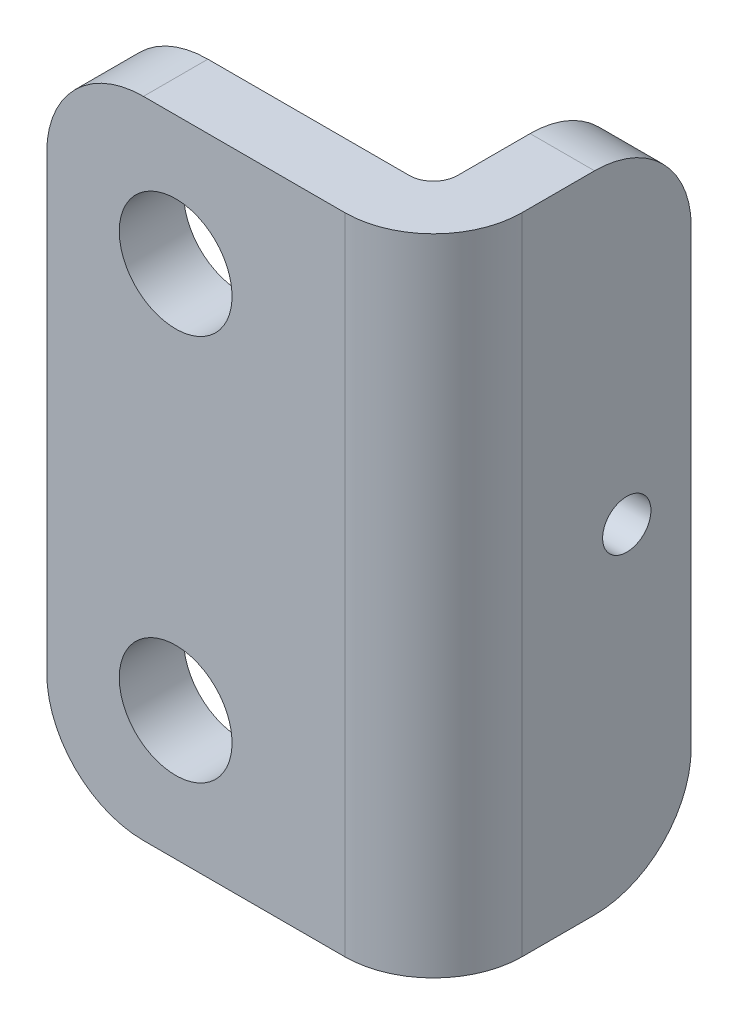
ISO-10303-21;
HEADER;
FILE_DESCRIPTION(('STEP AP214'),'2;1');
FILE_NAME('part.step','',(''),(''),'','','');
FILE_SCHEMA(('AUTOMOTIVE_DESIGN { 1 0 10303 214 1 1 1 1 }'));
ENDSEC;
DATA;
#1=APPLICATION_CONTEXT('core data for automotive mechanical design processes');
#2=APPLICATION_PROTOCOL_DEFINITION('international standard','automotive_design',2000,#1);
#3=PRODUCT_CONTEXT('',#1,'mechanical');
#4=PRODUCT('Part','Part','',(#3));
#5=PRODUCT_RELATED_PRODUCT_CATEGORY('part','',(#4));
#6=PRODUCT_DEFINITION_FORMATION('','',#4);
#7=PRODUCT_DEFINITION_CONTEXT('part definition',#1,'design');
#8=PRODUCT_DEFINITION('design','',#6,#7);
#9=PRODUCT_DEFINITION_SHAPE('','',#8);
#10=(LENGTH_UNIT() NAMED_UNIT(*) SI_UNIT(.MILLI.,.METRE.));
#11=(NAMED_UNIT(*) PLANE_ANGLE_UNIT() SI_UNIT($,.RADIAN.));
#12=(NAMED_UNIT(*) SI_UNIT($,.STERADIAN.) SOLID_ANGLE_UNIT());
#13=UNCERTAINTY_MEASURE_WITH_UNIT(LENGTH_MEASURE(1.E-05),#10,'distance_accuracy_value','');
#14=(GEOMETRIC_REPRESENTATION_CONTEXT(3) GLOBAL_UNCERTAINTY_ASSIGNED_CONTEXT((#13)) GLOBAL_UNIT_ASSIGNED_CONTEXT((#10,
#11,#12)) REPRESENTATION_CONTEXT('',''));
#15=CARTESIAN_POINT('',(0.,0.,0.));
#16=DIRECTION('',(0.,0.,1.));
#17=DIRECTION('',(1.,0.,0.));
#18=AXIS2_PLACEMENT_3D('',#15,#16,#17);
#19=CARTESIAN_POINT('',(-1.,20.,-1.75000000000001));
#20=DIRECTION('',(1.,0.,0.));
#21=DIRECTION('',(0.,0.,-1.));
#22=AXIS2_PLACEMENT_3D('',#19,#20,#21);
#23=PLANE('',#22);
#24=CARTESIAN_POINT('',(-1.,10.,-5.));
#25=DIRECTION('',(-1.,0.,0.));
#26=DIRECTION('',(0.,0.,1.));
#27=AXIS2_PLACEMENT_3D('',#24,#25,#26);
#28=CIRCLE('',#27,0.75);
#29=CARTESIAN_POINT('',(-1.,10.,-4.25));
#30=VERTEX_POINT('',#29);
#31=EDGE_CURVE('E234',#30,#30,#28,.T.);
#32=ORIENTED_EDGE('',*,*,#31,.F.);
#33=EDGE_LOOP('',(#32));
#34=FACE_BOUND('',#33,.T.);
#35=DIRECTION('',(0.,-1.,0.));
#36=VECTOR('',#35,1.);
#37=CARTESIAN_POINT('',(-1.,20.,-7.));
#38=LINE('',#37,#36);
#39=CARTESIAN_POINT('',(-1.,17.,-7.));
#40=VERTEX_POINT('',#39);
#41=CARTESIAN_POINT('',(-1.,3.,-7.));
#42=VERTEX_POINT('',#41);
#43=EDGE_CURVE('E201',#40,#42,#38,.T.);
#44=ORIENTED_EDGE('',*,*,#43,.T.);
#45=CARTESIAN_POINT('',(-1.,3.,-4.));
#46=DIRECTION('',(1.,0.,0.));
#47=DIRECTION('',(0.,0.,-1.));
#48=AXIS2_PLACEMENT_3D('',#45,#46,#47);
#49=CIRCLE('',#48,3.);
#50=CARTESIAN_POINT('',(-1.,0.,-4.));
#51=VERTEX_POINT('',#50);
#52=EDGE_CURVE('E160',#42,#51,#49,.F.);
#53=ORIENTED_EDGE('',*,*,#52,.T.);
#54=DIRECTION('',(0.,0.,1.));
#55=VECTOR('',#54,1.);
#56=CARTESIAN_POINT('',(-1.,0.,-1.75000000000001));
#57=LINE('',#56,#55);
#58=CARTESIAN_POINT('',(-1.,0.,-1.75000000000001));
#59=VERTEX_POINT('',#58);
#60=EDGE_CURVE('E146',#51,#59,#57,.T.);
#61=ORIENTED_EDGE('',*,*,#60,.T.);
#62=DIRECTION('',(0.,-1.,0.));
#63=VECTOR('',#62,1.);
#64=CARTESIAN_POINT('',(-1.,20.,-1.75000000000001));
#65=LINE('',#64,#63);
#66=CARTESIAN_POINT('',(-1.,20.,-1.75000000000001));
#67=VERTEX_POINT('',#66);
#68=EDGE_CURVE('E138',#67,#59,#65,.T.);
#69=ORIENTED_EDGE('',*,*,#68,.F.);
#70=DIRECTION('',(0.,0.,1.));
#71=VECTOR('',#70,1.);
#72=CARTESIAN_POINT('',(-1.,20.,-1.75000000000001));
#73=LINE('',#72,#71);
#74=CARTESIAN_POINT('',(-1.,20.,-4.));
#75=VERTEX_POINT('',#74);
#76=EDGE_CURVE('E122',#75,#67,#73,.T.);
#77=ORIENTED_EDGE('',*,*,#76,.F.);
#78=CARTESIAN_POINT('',(-1.,17.,-4.));
#79=DIRECTION('',(1.,0.,0.));
#80=DIRECTION('',(0.,0.,-1.));
#81=AXIS2_PLACEMENT_3D('',#78,#79,#80);
#82=CIRCLE('',#81,3.);
#83=EDGE_CURVE('E158',#75,#40,#82,.F.);
#84=ORIENTED_EDGE('',*,*,#83,.T.);
#85=EDGE_LOOP('',(#44,#53,#61,#69,#77,#84));
#86=FACE_BOUND('',#85,.T.);
#87=ADVANCED_FACE('F33',(#34,#86),#23,.F.);
#88=CARTESIAN_POINT('',(-1.75,20.,-1.75));
#89=DIRECTION('',(0.,-1.,0.));
#90=DIRECTION('',(0.,0.,-1.));
#91=AXIS2_PLACEMENT_3D('',#88,#89,#90);
#92=CYLINDRICAL_SURFACE('',#91,0.75);
#93=CARTESIAN_POINT('',(-1.75,0.,-1.75));
#94=DIRECTION('',(0.,-1.,0.));
#95=DIRECTION('',(0.,0.,1.));
#96=AXIS2_PLACEMENT_3D('',#93,#94,#95);
#97=CIRCLE('',#96,0.75);
#98=CARTESIAN_POINT('',(-1.75000000000001,0.,-1.));
#99=VERTEX_POINT('',#98);
#100=EDGE_CURVE('E212',#59,#99,#97,.T.);
#101=ORIENTED_EDGE('',*,*,#100,.T.);
#102=DIRECTION('',(0.,-1.,0.));
#103=VECTOR('',#102,1.);
#104=CARTESIAN_POINT('',(-1.75000000000001,20.,-1.));
#105=LINE('',#104,#103);
#106=CARTESIAN_POINT('',(-1.75000000000001,20.,-1.));
#107=VERTEX_POINT('',#106);
#108=EDGE_CURVE('E140',#107,#99,#105,.T.);
#109=ORIENTED_EDGE('',*,*,#108,.F.);
#110=CARTESIAN_POINT('',(-1.75,20.,-1.75));
#111=DIRECTION('',(0.,-1.,0.));
#112=DIRECTION('',(0.,0.,1.));
#113=AXIS2_PLACEMENT_3D('',#110,#111,#112);
#114=CIRCLE('',#113,0.75);
#115=EDGE_CURVE('E127',#67,#107,#114,.T.);
#116=ORIENTED_EDGE('',*,*,#115,.F.);
#117=ORIENTED_EDGE('',*,*,#68,.T.);
#118=EDGE_LOOP('',(#101,#109,#116,#117));
#119=FACE_BOUND('',#118,.T.);
#120=ADVANCED_FACE('F137',(#119),#92,.F.);
#121=CARTESIAN_POINT('',(-11.,20.,-1.));
#122=DIRECTION('',(0.,0.,1.));
#123=DIRECTION('',(1.,0.,0.));
#124=AXIS2_PLACEMENT_3D('',#121,#122,#123);
#125=PLANE('',#124);
#126=CARTESIAN_POINT('',(-7.,16.,-1.));
#127=DIRECTION('',(0.,0.,-1.));
#128=DIRECTION('',(-1.,0.,0.));
#129=AXIS2_PLACEMENT_3D('',#126,#127,#128);
#130=CIRCLE('',#129,1.75);
#131=CARTESIAN_POINT('',(-8.75,16.,-1.));
#132=VERTEX_POINT('',#131);
#133=EDGE_CURVE('E229',#132,#132,#130,.T.);
#134=ORIENTED_EDGE('',*,*,#133,.F.);
#135=EDGE_LOOP('',(#134));
#136=FACE_BOUND('',#135,.T.);
#137=CARTESIAN_POINT('',(-7.,4.,-1.));
#138=DIRECTION('',(0.,0.,-1.));
#139=DIRECTION('',(-1.,0.,0.));
#140=AXIS2_PLACEMENT_3D('',#137,#138,#139);
#141=CIRCLE('',#140,1.75);
#142=CARTESIAN_POINT('',(-8.75,4.,-1.));
#143=VERTEX_POINT('',#142);
#144=EDGE_CURVE('E222',#143,#143,#141,.T.);
#145=ORIENTED_EDGE('',*,*,#144,.F.);
#146=EDGE_LOOP('',(#145));
#147=FACE_BOUND('',#146,.T.);
#148=DIRECTION('',(0.,-1.,0.));
#149=VECTOR('',#148,1.);
#150=CARTESIAN_POINT('',(-11.,20.,-1.));
#151=LINE('',#150,#149);
#152=CARTESIAN_POINT('',(-11.,17.,-1.));
#153=VERTEX_POINT('',#152);
#154=CARTESIAN_POINT('',(-11.,3.,-1.));
#155=VERTEX_POINT('',#154);
#156=EDGE_CURVE('E152',#153,#155,#151,.T.);
#157=ORIENTED_EDGE('',*,*,#156,.F.);
#158=CARTESIAN_POINT('',(-8.,17.,-1.));
#159=DIRECTION('',(0.,0.,1.));
#160=DIRECTION('',(1.,0.,0.));
#161=AXIS2_PLACEMENT_3D('',#158,#159,#160);
#162=CIRCLE('',#161,3.);
#163=CARTESIAN_POINT('',(-8.,20.,-1.));
#164=VERTEX_POINT('',#163);
#165=EDGE_CURVE('E11',#153,#164,#162,.F.);
#166=ORIENTED_EDGE('',*,*,#165,.T.);
#167=DIRECTION('',(-1.,0.,0.));
#168=VECTOR('',#167,1.);
#169=CARTESIAN_POINT('',(-11.,20.,-1.));
#170=LINE('',#169,#168);
#171=EDGE_CURVE('E142',#107,#164,#170,.T.);
#172=ORIENTED_EDGE('',*,*,#171,.F.);
#173=ORIENTED_EDGE('',*,*,#108,.T.);
#174=DIRECTION('',(-1.,0.,0.));
#175=VECTOR('',#174,1.);
#176=CARTESIAN_POINT('',(-11.,0.,-1.));
#177=LINE('',#176,#175);
#178=CARTESIAN_POINT('',(-8.,0.,-1.));
#179=VERTEX_POINT('',#178);
#180=EDGE_CURVE('E210',#99,#179,#177,.T.);
#181=ORIENTED_EDGE('',*,*,#180,.T.);
#182=CARTESIAN_POINT('',(-8.,3.,-1.));
#183=DIRECTION('',(0.,0.,1.));
#184=DIRECTION('',(1.,0.,0.));
#185=AXIS2_PLACEMENT_3D('',#182,#183,#184);
#186=CIRCLE('',#185,3.);
#187=EDGE_CURVE('E41',#179,#155,#186,.F.);
#188=ORIENTED_EDGE('',*,*,#187,.T.);
#189=EDGE_LOOP('',(#157,#166,#172,#173,#181,#188));
#190=FACE_BOUND('',#189,.T.);
#191=ADVANCED_FACE('F255',(#136,#147,#190),#125,.F.);
#192=CARTESIAN_POINT('',(-11.,20.,1.));
#193=DIRECTION('',(1.,0.,0.));
#194=DIRECTION('',(0.,0.,-1.));
#195=AXIS2_PLACEMENT_3D('',#192,#193,#194);
#196=PLANE('',#195);
#197=DIRECTION('',(0.,-1.,0.));
#198=VECTOR('',#197,1.);
#199=CARTESIAN_POINT('',(-11.,20.,1.));
#200=LINE('',#199,#198);
#201=CARTESIAN_POINT('',(-11.,17.,1.));
#202=VERTEX_POINT('',#201);
#203=CARTESIAN_POINT('',(-11.,3.,1.));
#204=VERTEX_POINT('',#203);
#205=EDGE_CURVE('E184',#202,#204,#200,.T.);
#206=ORIENTED_EDGE('',*,*,#205,.F.);
#207=DIRECTION('',(0.,0.,1.));
#208=VECTOR('',#207,1.);
#209=CARTESIAN_POINT('',(-11.,17.,1.));
#210=LINE('',#209,#208);
#211=EDGE_CURVE('E54',#202,#153,#210,.F.);
#212=ORIENTED_EDGE('',*,*,#211,.T.);
#213=ORIENTED_EDGE('',*,*,#156,.T.);
#214=DIRECTION('',(0.,0.,1.));
#215=VECTOR('',#214,1.);
#216=CARTESIAN_POINT('',(-11.,3.,1.));
#217=LINE('',#216,#215);
#218=EDGE_CURVE('E178',#155,#204,#217,.T.);
#219=ORIENTED_EDGE('',*,*,#218,.T.);
#220=EDGE_LOOP('',(#206,#212,#213,#219));
#221=FACE_BOUND('',#220,.T.);
#222=ADVANCED_FACE('F183',(#221),#196,.F.);
#223=CARTESIAN_POINT('',(-1.75000000000002,20.,0.999999999999999));
#224=DIRECTION('',(0.,0.,-1.));
#225=DIRECTION('',(-1.,0.,0.));
#226=AXIS2_PLACEMENT_3D('',#223,#224,#225);
#227=PLANE('',#226);
#228=CARTESIAN_POINT('',(-7.,16.,1.));
#229=DIRECTION('',(0.,0.,-1.));
#230=DIRECTION('',(-1.,0.,0.));
#231=AXIS2_PLACEMENT_3D('',#228,#229,#230);
#232=CIRCLE('',#231,1.75);
#233=CARTESIAN_POINT('',(-8.75,16.,1.));
#234=VERTEX_POINT('',#233);
#235=EDGE_CURVE('E215',#234,#234,#232,.T.);
#236=ORIENTED_EDGE('',*,*,#235,.T.);
#237=EDGE_LOOP('',(#236));
#238=FACE_BOUND('',#237,.T.);
#239=CARTESIAN_POINT('',(-7.,4.,1.));
#240=DIRECTION('',(0.,0.,-1.));
#241=DIRECTION('',(-1.,0.,0.));
#242=AXIS2_PLACEMENT_3D('',#239,#240,#241);
#243=CIRCLE('',#242,1.75);
#244=CARTESIAN_POINT('',(-8.75,4.,1.));
#245=VERTEX_POINT('',#244);
#246=EDGE_CURVE('E225',#245,#245,#243,.T.);
#247=ORIENTED_EDGE('',*,*,#246,.T.);
#248=EDGE_LOOP('',(#247));
#249=FACE_BOUND('',#248,.T.);
#250=DIRECTION('',(1.,0.,0.));
#251=VECTOR('',#250,1.);
#252=CARTESIAN_POINT('',(-1.75000000000002,20.,0.999999999999999));
#253=LINE('',#252,#251);
#254=CARTESIAN_POINT('',(-8.,20.,1.));
#255=VERTEX_POINT('',#254);
#256=CARTESIAN_POINT('',(-1.75000000000002,20.,0.999999999999999));
#257=VERTEX_POINT('',#256);
#258=EDGE_CURVE('E219',#255,#257,#253,.T.);
#259=ORIENTED_EDGE('',*,*,#258,.F.);
#260=CARTESIAN_POINT('',(-8.,17.,1.));
#261=DIRECTION('',(0.,0.,-1.));
#262=DIRECTION('',(-1.,0.,0.));
#263=AXIS2_PLACEMENT_3D('',#260,#261,#262);
#264=CIRCLE('',#263,3.);
#265=EDGE_CURVE('E176',#255,#202,#264,.F.);
#266=ORIENTED_EDGE('',*,*,#265,.T.);
#267=ORIENTED_EDGE('',*,*,#205,.T.);
#268=CARTESIAN_POINT('',(-8.,3.,1.));
#269=DIRECTION('',(0.,0.,-1.));
#270=DIRECTION('',(-1.,0.,0.));
#271=AXIS2_PLACEMENT_3D('',#268,#269,#270);
#272=CIRCLE('',#271,3.);
#273=CARTESIAN_POINT('',(-8.,0.,1.));
#274=VERTEX_POINT('',#273);
#275=EDGE_CURVE('E174',#204,#274,#272,.F.);
#276=ORIENTED_EDGE('',*,*,#275,.T.);
#277=DIRECTION('',(1.,0.,0.));
#278=VECTOR('',#277,1.);
#279=CARTESIAN_POINT('',(-1.75000000000002,0.,0.999999999999999));
#280=LINE('',#279,#278);
#281=CARTESIAN_POINT('',(-1.75000000000002,0.,0.999999999999999));
#282=VERTEX_POINT('',#281);
#283=EDGE_CURVE('E208',#274,#282,#280,.T.);
#284=ORIENTED_EDGE('',*,*,#283,.T.);
#285=DIRECTION('',(0.,-1.,0.));
#286=VECTOR('',#285,1.);
#287=CARTESIAN_POINT('',(-1.75000000000002,20.,0.999999999999999));
#288=LINE('',#287,#286);
#289=EDGE_CURVE('E190',#257,#282,#288,.T.);
#290=ORIENTED_EDGE('',*,*,#289,.F.);
#291=EDGE_LOOP('',(#259,#266,#267,#276,#284,#290));
#292=FACE_BOUND('',#291,.T.);
#293=ADVANCED_FACE('F188',(#238,#249,#292),#227,.F.);
#294=CARTESIAN_POINT('',(-1.75,20.,-1.75));
#295=DIRECTION('',(0.,-1.,0.));
#296=DIRECTION('',(0.,0.,-1.));
#297=AXIS2_PLACEMENT_3D('',#294,#295,#296);
#298=CYLINDRICAL_SURFACE('',#297,2.75);
#299=CARTESIAN_POINT('',(-1.75,0.,-1.75));
#300=DIRECTION('',(0.,1.,0.));
#301=DIRECTION('',(0.,0.,-1.));
#302=AXIS2_PLACEMENT_3D('',#299,#300,#301);
#303=CIRCLE('',#302,2.75);
#304=CARTESIAN_POINT('',(1.,0.,-1.75000000000002));
#305=VERTEX_POINT('',#304);
#306=EDGE_CURVE('E206',#282,#305,#303,.T.);
#307=ORIENTED_EDGE('',*,*,#306,.T.);
#308=DIRECTION('',(0.,-1.,0.));
#309=VECTOR('',#308,1.);
#310=CARTESIAN_POINT('',(1.,20.,-1.75000000000002));
#311=LINE('',#310,#309);
#312=CARTESIAN_POINT('',(1.,20.,-1.75000000000002));
#313=VERTEX_POINT('',#312);
#314=EDGE_CURVE('E193',#313,#305,#311,.T.);
#315=ORIENTED_EDGE('',*,*,#314,.F.);
#316=CARTESIAN_POINT('',(-1.75,20.,-1.75));
#317=DIRECTION('',(0.,1.,0.));
#318=DIRECTION('',(0.,0.,-1.));
#319=AXIS2_PLACEMENT_3D('',#316,#317,#318);
#320=CIRCLE('',#319,2.75);
#321=EDGE_CURVE('E217',#257,#313,#320,.T.);
#322=ORIENTED_EDGE('',*,*,#321,.F.);
#323=ORIENTED_EDGE('',*,*,#289,.T.);
#324=EDGE_LOOP('',(#307,#315,#322,#323));
#325=FACE_BOUND('',#324,.T.);
#326=ADVANCED_FACE('F281',(#325),#298,.T.);
#327=CARTESIAN_POINT('',(1.,20.,-7.));
#328=DIRECTION('',(-1.,0.,0.));
#329=DIRECTION('',(0.,0.,1.));
#330=AXIS2_PLACEMENT_3D('',#327,#328,#329);
#331=PLANE('',#330);
#332=CARTESIAN_POINT('',(1.,10.,-5.));
#333=DIRECTION('',(-1.,0.,0.));
#334=DIRECTION('',(0.,0.,1.));
#335=AXIS2_PLACEMENT_3D('',#332,#333,#334);
#336=CIRCLE('',#335,0.75);
#337=CARTESIAN_POINT('',(1.,10.,-4.25));
#338=VERTEX_POINT('',#337);
#339=EDGE_CURVE('E226',#338,#338,#336,.T.);
#340=ORIENTED_EDGE('',*,*,#339,.T.);
#341=EDGE_LOOP('',(#340));
#342=FACE_BOUND('',#341,.T.);
#343=DIRECTION('',(0.,0.,-1.));
#344=VECTOR('',#343,1.);
#345=CARTESIAN_POINT('',(1.,0.,-7.));
#346=LINE('',#345,#344);
#347=CARTESIAN_POINT('',(1.,0.,-4.));
#348=VERTEX_POINT('',#347);
#349=EDGE_CURVE('E133',#305,#348,#346,.T.);
#350=ORIENTED_EDGE('',*,*,#349,.T.);
#351=CARTESIAN_POINT('',(1.,3.,-4.));
#352=DIRECTION('',(-1.,0.,0.));
#353=DIRECTION('',(0.,0.,1.));
#354=AXIS2_PLACEMENT_3D('',#351,#352,#353);
#355=CIRCLE('',#354,3.);
#356=CARTESIAN_POINT('',(1.,3.,-7.));
#357=VERTEX_POINT('',#356);
#358=EDGE_CURVE('E168',#348,#357,#355,.F.);
#359=ORIENTED_EDGE('',*,*,#358,.T.);
#360=DIRECTION('',(0.,-1.,0.));
#361=VECTOR('',#360,1.);
#362=CARTESIAN_POINT('',(1.,20.,-7.));
#363=LINE('',#362,#361);
#364=CARTESIAN_POINT('',(1.,17.,-7.));
#365=VERTEX_POINT('',#364);
#366=EDGE_CURVE('E198',#365,#357,#363,.T.);
#367=ORIENTED_EDGE('',*,*,#366,.F.);
#368=CARTESIAN_POINT('',(1.,17.,-4.));
#369=DIRECTION('',(-1.,0.,0.));
#370=DIRECTION('',(0.,0.,1.));
#371=AXIS2_PLACEMENT_3D('',#368,#369,#370);
#372=CIRCLE('',#371,3.);
#373=CARTESIAN_POINT('',(1.,20.,-4.));
#374=VERTEX_POINT('',#373);
#375=EDGE_CURVE('E166',#365,#374,#372,.F.);
#376=ORIENTED_EDGE('',*,*,#375,.T.);
#377=DIRECTION('',(0.,0.,-1.));
#378=VECTOR('',#377,1.);
#379=CARTESIAN_POINT('',(1.,20.,-7.));
#380=LINE('',#379,#378);
#381=EDGE_CURVE('E203',#313,#374,#380,.T.);
#382=ORIENTED_EDGE('',*,*,#381,.F.);
#383=ORIENTED_EDGE('',*,*,#314,.T.);
#384=EDGE_LOOP('',(#350,#359,#367,#376,#382,#383));
#385=FACE_BOUND('',#384,.T.);
#386=ADVANCED_FACE('F240',(#342,#385),#331,.F.);
#387=CARTESIAN_POINT('',(-1.,20.,-7.));
#388=DIRECTION('',(0.,0.,1.));
#389=DIRECTION('',(1.,0.,0.));
#390=AXIS2_PLACEMENT_3D('',#387,#388,#389);
#391=PLANE('',#390);
#392=ORIENTED_EDGE('',*,*,#366,.T.);
#393=DIRECTION('',(-1.,0.,0.));
#394=VECTOR('',#393,1.);
#395=CARTESIAN_POINT('',(-1.,3.,-7.));
#396=LINE('',#395,#394);
#397=EDGE_CURVE('E150',#357,#42,#396,.T.);
#398=ORIENTED_EDGE('',*,*,#397,.T.);
#399=ORIENTED_EDGE('',*,*,#43,.F.);
#400=DIRECTION('',(-1.,0.,0.));
#401=VECTOR('',#400,1.);
#402=CARTESIAN_POINT('',(-1.,17.,-7.));
#403=LINE('',#402,#401);
#404=EDGE_CURVE('E148',#40,#365,#403,.F.);
#405=ORIENTED_EDGE('',*,*,#404,.T.);
#406=EDGE_LOOP('',(#392,#398,#399,#405));
#407=FACE_BOUND('',#406,.T.);
#408=ADVANCED_FACE('F287',(#407),#391,.F.);
#409=CARTESIAN_POINT('',(-1.75,20.,-1.75));
#410=DIRECTION('',(0.,-1.,0.));
#411=DIRECTION('',(0.,0.,-1.));
#412=AXIS2_PLACEMENT_3D('',#409,#410,#411);
#413=PLANE('',#412);
#414=ORIENTED_EDGE('',*,*,#381,.T.);
#415=DIRECTION('',(-1.,0.,0.));
#416=VECTOR('',#415,1.);
#417=CARTESIAN_POINT('',(-1.75,20.,-4.));
#418=LINE('',#417,#416);
#419=EDGE_CURVE('E130',#374,#75,#418,.T.);
#420=ORIENTED_EDGE('',*,*,#419,.T.);
#421=ORIENTED_EDGE('',*,*,#76,.T.);
#422=ORIENTED_EDGE('',*,*,#115,.T.);
#423=ORIENTED_EDGE('',*,*,#171,.T.);
#424=DIRECTION('',(0.,0.,1.));
#425=VECTOR('',#424,1.);
#426=CARTESIAN_POINT('',(-8.,20.,-1.75000000000001));
#427=LINE('',#426,#425);
#428=EDGE_CURVE('E170',#164,#255,#427,.T.);
#429=ORIENTED_EDGE('',*,*,#428,.T.);
#430=ORIENTED_EDGE('',*,*,#258,.T.);
#431=ORIENTED_EDGE('',*,*,#321,.T.);
#432=EDGE_LOOP('',(#414,#420,#421,#422,#423,#429,#430,#431));
#433=FACE_BOUND('',#432,.T.);
#434=ADVANCED_FACE('F125',(#433),#413,.F.);
#435=CARTESIAN_POINT('',(-1.75,0.,-1.75));
#436=DIRECTION('',(0.,-1.,0.));
#437=DIRECTION('',(0.,0.,-1.));
#438=AXIS2_PLACEMENT_3D('',#435,#436,#437);
#439=PLANE('',#438);
#440=ORIENTED_EDGE('',*,*,#60,.F.);
#441=DIRECTION('',(-1.,0.,0.));
#442=VECTOR('',#441,1.);
#443=CARTESIAN_POINT('',(1.,0.,-4.));
#444=LINE('',#443,#442);
#445=EDGE_CURVE('E164',#51,#348,#444,.F.);
#446=ORIENTED_EDGE('',*,*,#445,.T.);
#447=ORIENTED_EDGE('',*,*,#349,.F.);
#448=ORIENTED_EDGE('',*,*,#306,.F.);
#449=ORIENTED_EDGE('',*,*,#283,.F.);
#450=DIRECTION('',(0.,0.,1.));
#451=VECTOR('',#450,1.);
#452=CARTESIAN_POINT('',(-8.,0.,-0.999999999999997));
#453=LINE('',#452,#451);
#454=EDGE_CURVE('E162',#274,#179,#453,.F.);
#455=ORIENTED_EDGE('',*,*,#454,.T.);
#456=ORIENTED_EDGE('',*,*,#180,.F.);
#457=ORIENTED_EDGE('',*,*,#100,.F.);
#458=EDGE_LOOP('',(#440,#446,#447,#448,#449,#455,#456,#457));
#459=FACE_BOUND('',#458,.T.);
#460=ADVANCED_FACE('F263',(#459),#439,.T.);
#461=CARTESIAN_POINT('',(-1.,3.,-4.));
#462=DIRECTION('',(1.,0.,0.));
#463=DIRECTION('',(0.,0.,-1.));
#464=AXIS2_PLACEMENT_3D('',#461,#462,#463);
#465=CYLINDRICAL_SURFACE('',#464,3.);
#466=ORIENTED_EDGE('',*,*,#358,.F.);
#467=ORIENTED_EDGE('',*,*,#445,.F.);
#468=ORIENTED_EDGE('',*,*,#52,.F.);
#469=ORIENTED_EDGE('',*,*,#397,.F.);
#470=EDGE_LOOP('',(#466,#467,#468,#469));
#471=FACE_BOUND('',#470,.T.);
#472=ADVANCED_FACE('F259',(#471),#465,.T.);
#473=CARTESIAN_POINT('',(-1.75,17.,-4.));
#474=DIRECTION('',(-1.,0.,0.));
#475=DIRECTION('',(0.,0.,1.));
#476=AXIS2_PLACEMENT_3D('',#473,#474,#475);
#477=CYLINDRICAL_SURFACE('',#476,3.);
#478=ORIENTED_EDGE('',*,*,#375,.F.);
#479=ORIENTED_EDGE('',*,*,#404,.F.);
#480=ORIENTED_EDGE('',*,*,#83,.F.);
#481=ORIENTED_EDGE('',*,*,#419,.F.);
#482=EDGE_LOOP('',(#478,#479,#480,#481));
#483=FACE_BOUND('',#482,.T.);
#484=ADVANCED_FACE('F262',(#483),#477,.T.);
#485=CARTESIAN_POINT('',(-8.,17.,-1.75000000000001));
#486=DIRECTION('',(0.,0.,1.));
#487=DIRECTION('',(1.,0.,0.));
#488=AXIS2_PLACEMENT_3D('',#485,#486,#487);
#489=CYLINDRICAL_SURFACE('',#488,3.);
#490=ORIENTED_EDGE('',*,*,#165,.F.);
#491=ORIENTED_EDGE('',*,*,#211,.F.);
#492=ORIENTED_EDGE('',*,*,#265,.F.);
#493=ORIENTED_EDGE('',*,*,#428,.F.);
#494=EDGE_LOOP('',(#490,#491,#492,#493));
#495=FACE_BOUND('',#494,.T.);
#496=ADVANCED_FACE('F266',(#495),#489,.T.);
#497=CARTESIAN_POINT('',(-8.,3.,1.));
#498=DIRECTION('',(0.,0.,-1.));
#499=DIRECTION('',(-1.,0.,0.));
#500=AXIS2_PLACEMENT_3D('',#497,#498,#499);
#501=CYLINDRICAL_SURFACE('',#500,3.);
#502=ORIENTED_EDGE('',*,*,#187,.F.);
#503=ORIENTED_EDGE('',*,*,#454,.F.);
#504=ORIENTED_EDGE('',*,*,#275,.F.);
#505=ORIENTED_EDGE('',*,*,#218,.F.);
#506=EDGE_LOOP('',(#502,#503,#504,#505));
#507=FACE_BOUND('',#506,.T.);
#508=ADVANCED_FACE('F35',(#507),#501,.T.);
#509=CARTESIAN_POINT('',(-7.,4.,1.));
#510=DIRECTION('',(0.,0.,-1.));
#511=DIRECTION('',(-1.,0.,0.));
#512=AXIS2_PLACEMENT_3D('',#509,#510,#511);
#513=CYLINDRICAL_SURFACE('',#512,1.75);
#514=ORIENTED_EDGE('',*,*,#246,.F.);
#515=EDGE_LOOP('',(#514));
#516=FACE_BOUND('',#515,.T.);
#517=ORIENTED_EDGE('',*,*,#144,.T.);
#518=EDGE_LOOP('',(#517));
#519=FACE_BOUND('',#518,.T.);
#520=ADVANCED_FACE('F273',(#516,#519),#513,.F.);
#521=CARTESIAN_POINT('',(-7.,16.,1.));
#522=DIRECTION('',(0.,0.,-1.));
#523=DIRECTION('',(-1.,0.,0.));
#524=AXIS2_PLACEMENT_3D('',#521,#522,#523);
#525=CYLINDRICAL_SURFACE('',#524,1.75);
#526=ORIENTED_EDGE('',*,*,#235,.F.);
#527=EDGE_LOOP('',(#526));
#528=FACE_BOUND('',#527,.T.);
#529=ORIENTED_EDGE('',*,*,#133,.T.);
#530=EDGE_LOOP('',(#529));
#531=FACE_BOUND('',#530,.T.);
#532=ADVANCED_FACE('F246',(#528,#531),#525,.F.);
#533=CARTESIAN_POINT('',(1.,10.,-5.));
#534=DIRECTION('',(-1.,0.,0.));
#535=DIRECTION('',(0.,0.,1.));
#536=AXIS2_PLACEMENT_3D('',#533,#534,#535);
#537=CYLINDRICAL_SURFACE('',#536,0.75);
#538=ORIENTED_EDGE('',*,*,#339,.F.);
#539=EDGE_LOOP('',(#538));
#540=FACE_BOUND('',#539,.T.);
#541=ORIENTED_EDGE('',*,*,#31,.T.);
#542=EDGE_LOOP('',(#541));
#543=FACE_BOUND('',#542,.T.);
#544=ADVANCED_FACE('F243',(#540,#543),#537,.F.);
#545=CLOSED_SHELL('',(#87,#120,#191,#222,#293,#326,#386,#408,#434,#460,#472,#484,#496,#508,#520,
#532,#544));
#546=MANIFOLD_SOLID_BREP('B2',#545);
#547=ADVANCED_BREP_SHAPE_REPRESENTATION('',(#18,#546),#14);
#548=SHAPE_DEFINITION_REPRESENTATION(#9,#547);
ENDSEC;
END-ISO-10303-21;
